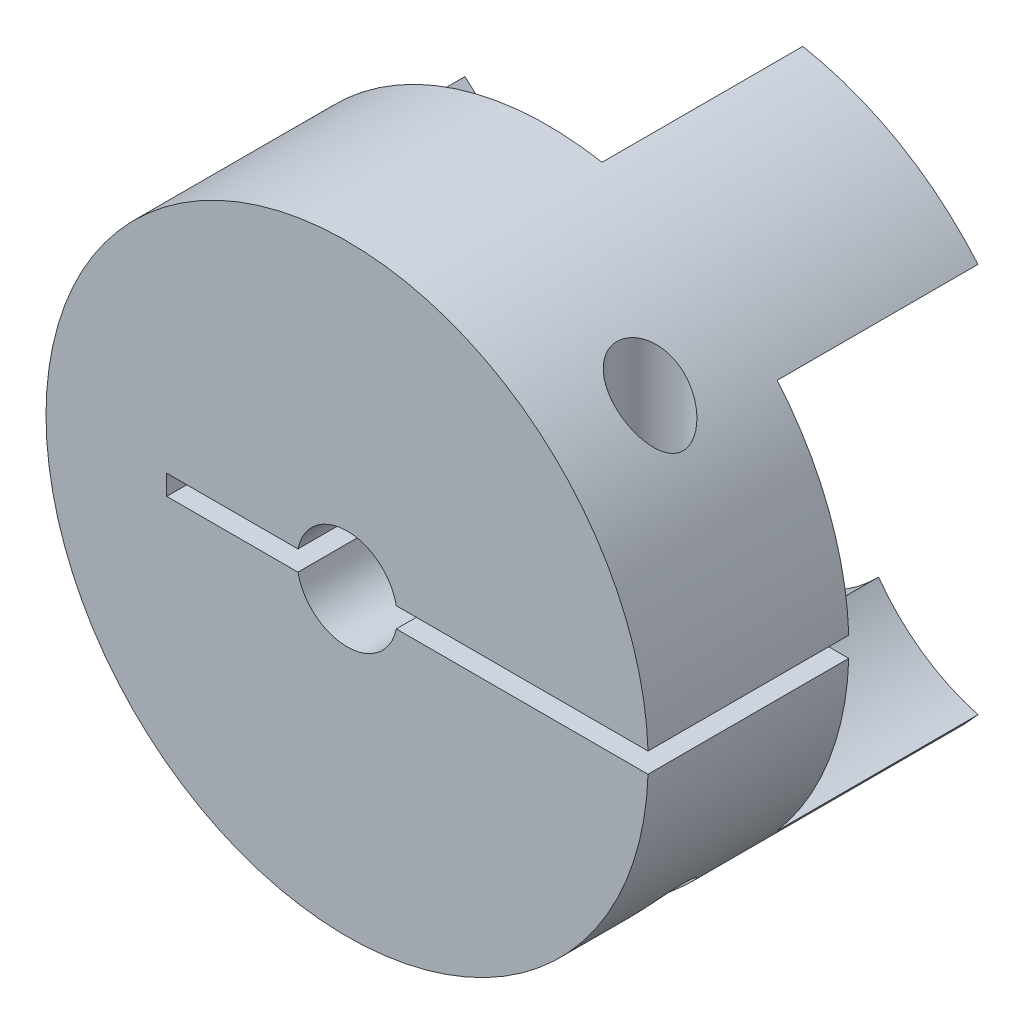
ISO-10303-21;
HEADER;
FILE_DESCRIPTION(('STEP AP214'),'2;1');
FILE_NAME('part.step','',(''),(''),'','','');
FILE_SCHEMA(('AUTOMOTIVE_DESIGN { 1 0 10303 214 1 1 1 1 }'));
ENDSEC;
DATA;
#1=APPLICATION_CONTEXT('core data for automotive mechanical design processes');
#2=APPLICATION_PROTOCOL_DEFINITION('international standard','automotive_design',2000,#1);
#3=PRODUCT_CONTEXT('',#1,'mechanical');
#4=PRODUCT('Part','Part','',(#3));
#5=PRODUCT_RELATED_PRODUCT_CATEGORY('part','',(#4));
#6=PRODUCT_DEFINITION_FORMATION('','',#4);
#7=PRODUCT_DEFINITION_CONTEXT('part definition',#1,'design');
#8=PRODUCT_DEFINITION('design','',#6,#7);
#9=PRODUCT_DEFINITION_SHAPE('','',#8);
#10=(LENGTH_UNIT() NAMED_UNIT(*) SI_UNIT(.MILLI.,.METRE.));
#11=(NAMED_UNIT(*) PLANE_ANGLE_UNIT() SI_UNIT($,.RADIAN.));
#12=(NAMED_UNIT(*) SI_UNIT($,.STERADIAN.) SOLID_ANGLE_UNIT());
#13=UNCERTAINTY_MEASURE_WITH_UNIT(LENGTH_MEASURE(1.E-05),#10,'distance_accuracy_value','');
#14=(GEOMETRIC_REPRESENTATION_CONTEXT(3) GLOBAL_UNCERTAINTY_ASSIGNED_CONTEXT((#13)) GLOBAL_UNIT_ASSIGNED_CONTEXT((#10,
#11,#12)) REPRESENTATION_CONTEXT('',''));
#15=CARTESIAN_POINT('',(0.,0.,0.));
#16=DIRECTION('',(0.,0.,1.));
#17=DIRECTION('',(1.,0.,0.));
#18=AXIS2_PLACEMENT_3D('',#15,#16,#17);
#19=CARTESIAN_POINT('',(0.,0.,10.));
#20=DIRECTION('',(0.,0.,-1.));
#21=DIRECTION('',(-1.,0.,0.));
#22=AXIS2_PLACEMENT_3D('',#19,#20,#21);
#23=CYLINDRICAL_SURFACE('',#22,15.);
#24=CARTESIAN_POINT('',(10.0926848649986,-11.0967433157584,6.64999999999999));
#25=CARTESIAN_POINT('',(10.220860438559,-10.980160062095,6.65000394336876));
#26=CARTESIAN_POINT('',(10.3471273917052,-10.8612229269204,6.63510189683597));
#27=CARTESIAN_POINT('',(10.5924882536645,-10.6220844812711,6.57754707789749));
#28=CARTESIAN_POINT('',(10.7115592667889,-10.5018804321502,6.53481035021963));
#29=CARTESIAN_POINT('',(10.9206842152966,-10.2838537071165,6.4311611472555));
#30=CARTESIAN_POINT('',(11.0123038847876,-10.1855773433474,6.37434827049272));
#31=CARTESIAN_POINT('',(11.1859779645528,-9.99451888211022,6.24064404925776));
#32=CARTESIAN_POINT('',(11.2680579371859,-9.90172244553978,6.16380823944328));
#33=CARTESIAN_POINT('',(11.3910130445927,-9.75961732755676,6.02083932939631));
#34=CARTESIAN_POINT('',(11.4358416775011,-9.70699350710171,5.96139536279118));
#35=CARTESIAN_POINT('',(11.5189294325514,-9.6082461595792,5.8331563997367));
#36=CARTESIAN_POINT('',(11.5571969249551,-9.56211436409998,5.76437352114217));
#37=CARTESIAN_POINT('',(11.61720832524,-9.48905574163493,5.63420275358693));
#38=CARTESIAN_POINT('',(11.6407280983695,-9.46015253291077,5.57475729279848));
#39=CARTESIAN_POINT('',(11.6812928822604,-9.41001803788935,5.45062994315805));
#40=CARTESIAN_POINT('',(11.6983474363425,-9.38877544601811,5.38595594473009));
#41=CARTESIAN_POINT('',(11.7226402284718,-9.35842022047249,5.26279919580116));
#42=CARTESIAN_POINT('',(11.7309771425616,-9.34795385730711,5.20487142165286));
#43=CARTESIAN_POINT('',(11.7414077625295,-9.33484965184739,5.08758583620345));
#44=CARTESIAN_POINT('',(11.7435052880787,-9.33220701997294,5.02822892225121));
#45=CARTESIAN_POINT('',(11.7412827480735,-9.33500302588684,4.90981268940671));
#46=CARTESIAN_POINT('',(11.7369605290622,-9.34044437538845,4.85075347704508));
#47=CARTESIAN_POINT('',(11.7222562805157,-9.35889108698574,4.73460774907923));
#48=CARTESIAN_POINT('',(11.7118697465427,-9.3719020716119,4.67752273328477));
#49=CARTESIAN_POINT('',(11.6823217305914,-9.40872177270143,4.55196679797297));
#50=CARTESIAN_POINT('',(11.6615720010284,-9.43446897755521,4.48444350956776));
#51=CARTESIAN_POINT('',(11.6132332127112,-9.49390766351091,4.35564766940138));
#52=CARTESIAN_POINT('',(11.5856313515365,-9.52761400953341,4.29438712482309));
#53=CARTESIAN_POINT('',(11.5114868632659,-9.61719101796808,4.15236323153544));
#54=CARTESIAN_POINT('',(11.4619983445573,-9.67622661823834,4.07515644235532));
#55=CARTESIAN_POINT('',(11.3548542023531,-9.80174144821854,3.93353788730325));
#56=CARTESIAN_POINT('',(11.2971810684216,-9.86823657146051,3.86915428462569));
#57=CARTESIAN_POINT('',(11.1922228746545,-9.98692207304509,3.76822768684491));
#58=CARTESIAN_POINT('',(11.146397279409,-10.0380648679906,3.7288816430101));
#59=CARTESIAN_POINT('',(11.0519268701954,-10.1419848088434,3.65615860473044));
#60=CARTESIAN_POINT('',(11.003280852126,-10.1947626482428,3.62278418492222));
#61=CARTESIAN_POINT('',(10.8536593264446,-10.3546753572824,3.53129103419908));
#62=CARTESIAN_POINT('',(10.7489920615334,-10.4633988528853,3.48179467086141));
#63=CARTESIAN_POINT('',(10.5297942497234,-10.6840187150194,3.40461454121079));
#64=CARTESIAN_POINT('',(10.4150877419815,-10.795928802806,3.3774804453615));
#65=CARTESIAN_POINT('',(10.1804192298437,-11.0174866267743,3.34810548693576));
#66=CARTESIAN_POINT('',(10.0604614497835,-11.127136080718,3.34584497150278));
#67=CARTESIAN_POINT('',(9.83623308607321,-11.3255272776318,3.36675714026146));
#68=CARTESIAN_POINT('',(9.73224615598701,-11.4149744827321,3.38624315175335));
#69=CARTESIAN_POINT('',(9.52558957542715,-11.5879767006159,3.4467897267209));
#70=CARTESIAN_POINT('',(9.42291855764459,-11.671538318211,3.48782565484048));
#71=CARTESIAN_POINT('',(9.24408155555656,-11.8134312770049,3.58213740665993));
#72=CARTESIAN_POINT('',(9.16688279938632,-11.8733726450193,3.63102343919311));
#73=CARTESIAN_POINT('',(9.01869485735856,-11.9863164848776,3.74393718530378));
#74=CARTESIAN_POINT('',(8.94769837818342,-12.0393271440691,3.80794677750154));
#75=CARTESIAN_POINT('',(8.8265258901828,-12.1283606004155,3.93891204527335));
#76=CARTESIAN_POINT('',(8.7748568921312,-12.1657408978823,4.00355780863429));
#77=CARTESIAN_POINT('',(8.68048826188,-12.2332534574999,4.14253663246763));
#78=CARTESIAN_POINT('',(8.63778600998008,-12.263387836973,4.21686685324224));
#79=CARTESIAN_POINT('',(8.56345920953926,-12.3154071535883,4.37423245519235));
#80=CARTESIAN_POINT('',(8.53190730351717,-12.337238062868,4.45732050224921));
#81=CARTESIAN_POINT('',(8.48237952216627,-12.3713443284604,4.62931580532342));
#82=CARTESIAN_POINT('',(8.4643950160246,-12.3836257597641,4.71821932267932));
#83=CARTESIAN_POINT('',(8.44451569678631,-12.3971882353683,4.88817885849845));
#84=CARTESIAN_POINT('',(8.44100911115321,-12.3995714254709,4.96896232475433));
#85=CARTESIAN_POINT('',(8.44584457546878,-12.3962784814689,5.12999178577486));
#86=CARTESIAN_POINT('',(8.45418267439061,-12.3906050348137,5.21023795079714));
#87=CARTESIAN_POINT('',(8.48156054926597,-12.3718787449858,5.36416607002223));
#88=CARTESIAN_POINT('',(8.50009990389054,-12.3591708145744,5.43798080021377));
#89=CARTESIAN_POINT('',(8.546548916629,-12.3270958939093,5.58105357268003));
#90=CARTESIAN_POINT('',(8.57445970592201,-12.3077280997699,5.65031106366561));
#91=CARTESIAN_POINT('',(8.63998142157508,-12.2618266323618,5.78621154394235));
#92=CARTESIAN_POINT('',(8.67801142192203,-12.2349801746752,5.85254532283313));
#93=CARTESIAN_POINT('',(8.76132380203988,-12.1754599473585,5.97756245987752));
#94=CARTESIAN_POINT('',(8.8066082488509,-12.1427845165521,6.03624362886971));
#95=CARTESIAN_POINT('',(8.90892316153622,-12.067956917377,6.15235960440661));
#96=CARTESIAN_POINT('',(8.96671505758629,-12.025127823739,6.20868408375652));
#97=CARTESIAN_POINT('',(9.08733597037259,-11.9342386437794,6.31073660691987));
#98=CARTESIAN_POINT('',(9.15017019469147,-11.886173130623,6.35645350090917));
#99=CARTESIAN_POINT('',(9.30868362889243,-11.7627607545485,6.45608296499284));
#100=CARTESIAN_POINT('',(9.40620131746137,-11.6850178304833,6.50412649559903));
#101=CARTESIAN_POINT('',(9.60378242449744,-11.5231815429662,6.57945385732573));
#102=CARTESIAN_POINT('',(9.70384670997769,-11.4390859969937,6.60673051775102));
#103=CARTESIAN_POINT('',(9.85209903926863,-11.3110684951432,6.63310718208843));
#104=CARTESIAN_POINT('',(9.90049346184272,-11.2687344646731,6.6394836552663));
#105=CARTESIAN_POINT('',(9.99690837246945,-11.1832899482693,6.64792786365697));
#106=CARTESIAN_POINT('',(10.044929092772,-11.1401800108535,6.64999853077606));
#107=CARTESIAN_POINT('',(10.0926848649986,-11.0967433157584,6.64999999999999));
#108=B_SPLINE_CURVE_WITH_KNOTS('',3,(#24,#25,#26,#27,#28,#29,#30,#31,#32,#33,#34,#35,#36,#37,
#38,#39,#40,#41,#42,#43,#44,#45,#46,#47,#48,#49,#50,#51,#52,#53,#54,#55,#56,#57,#58,#59,#60,#61,
#62,#63,#64,#65,#66,#67,#68,#69,#70,#71,#72,#73,#74,#75,#76,#77,#78,#79,#80,#81,#82,#83,#84,#85,
#86,#87,#88,#89,#90,#91,#92,#93,#94,#95,#96,#97,#98,#99,#100,#101,#102,#103,#104,#105,#106,
#107),.UNSPECIFIED.,.T.,.F.,(4,2,2,2,2,2,2,2,2,2,2,2,2,2,2,2,2,2,2,2,2,2,2,2,2,2,2,2,2,2,2,2,2,
2,2,2,2,2,2,2,2,4),(0.,0.519563013751446,1.04070044218863,1.47686845704516,1.91183937942442,
2.18464870505687,2.45710736661819,2.6668481800779,2.87627817795231,3.05384656799502,
3.23130623062402,3.40882543425908,3.5864766632454,3.81078920641685,4.0355240483546,
4.3609310771128,4.68704509251657,4.92417500520975,5.16140691024388,5.63582699382098,
6.12158721994665,6.60696361463315,7.02105160658517,7.43466725009816,7.76128715105097,
8.08751765610298,8.3588299592513,8.63006288590478,8.90303161306048,9.17582654617326,
9.41726596898013,9.65862487384102,9.88908129959951,10.119565552609,10.3617025461375,
10.6039086559017,10.8769583737547,11.150293811886,11.549083529721,11.9480108852548,
12.1417220922424,12.335301354288),.UNSPECIFIED.);
#109=CARTESIAN_POINT('',(10.0926848649986,-11.0967433157584,6.64999999999999));
#110=VERTEX_POINT('',#109);
#111=EDGE_CURVE('E43',#110,#110,#108,.T.);
#112=ORIENTED_EDGE('',*,*,#111,.T.);
#113=EDGE_LOOP('',(#112));
#114=FACE_BOUND('',#113,.T.);
#115=CARTESIAN_POINT('',(10.0926848649986,11.0967433157584,3.35000000000001));
#116=CARTESIAN_POINT('',(10.220860438559,10.980160062095,3.34999605663124));
#117=CARTESIAN_POINT('',(10.3471273917052,10.8612229269204,3.36489810316403));
#118=CARTESIAN_POINT('',(10.5924882536645,10.6220844812711,3.42245292210251));
#119=CARTESIAN_POINT('',(10.7115592667889,10.5018804321502,3.46518964978037));
#120=CARTESIAN_POINT('',(10.9206842152966,10.2838537071165,3.5688388527445));
#121=CARTESIAN_POINT('',(11.0123038847876,10.1855773433474,3.62565172950728));
#122=CARTESIAN_POINT('',(11.1859779645528,9.99451888211022,3.75935595074224));
#123=CARTESIAN_POINT('',(11.2680579371859,9.90172244553978,3.83619176055672));
#124=CARTESIAN_POINT('',(11.3910130445927,9.75961732755676,3.97916067060369));
#125=CARTESIAN_POINT('',(11.4358416775011,9.70699350710171,4.03860463720882));
#126=CARTESIAN_POINT('',(11.5189294325514,9.6082461595792,4.1668436002633));
#127=CARTESIAN_POINT('',(11.5571969249551,9.56211436409998,4.23562647885784));
#128=CARTESIAN_POINT('',(11.61720832524,9.48905574163493,4.36579724641307));
#129=CARTESIAN_POINT('',(11.6407280983695,9.46015253291077,4.42524270720152));
#130=CARTESIAN_POINT('',(11.6812928822604,9.41001803788935,4.54937005684195));
#131=CARTESIAN_POINT('',(11.6983474363425,9.38877544601811,4.61404405526991));
#132=CARTESIAN_POINT('',(11.7226402284718,9.35842022047249,4.73720080419884));
#133=CARTESIAN_POINT('',(11.7309771425616,9.34795385730711,4.79512857834714));
#134=CARTESIAN_POINT('',(11.7414077625295,9.33484965184739,4.91241416379655));
#135=CARTESIAN_POINT('',(11.7435052880787,9.33220701997294,4.97177107774879));
#136=CARTESIAN_POINT('',(11.7412827480735,9.33500302588684,5.09018731059329));
#137=CARTESIAN_POINT('',(11.7369605290622,9.34044437538845,5.14924652295492));
#138=CARTESIAN_POINT('',(11.7222562805157,9.35889108698574,5.26539225092077));
#139=CARTESIAN_POINT('',(11.7118697465427,9.3719020716119,5.32247726671523));
#140=CARTESIAN_POINT('',(11.6823217305914,9.40872177270143,5.44803320202703));
#141=CARTESIAN_POINT('',(11.6615720010284,9.43446897755521,5.51555649043224));
#142=CARTESIAN_POINT('',(11.6132332127112,9.49390766351091,5.64435233059862));
#143=CARTESIAN_POINT('',(11.5856313515365,9.52761400953341,5.70561287517691));
#144=CARTESIAN_POINT('',(11.5114868632659,9.61719101796808,5.84763676846456));
#145=CARTESIAN_POINT('',(11.4619983445573,9.67622661823834,5.92484355764468));
#146=CARTESIAN_POINT('',(11.3548542023531,9.80174144821854,6.06646211269675));
#147=CARTESIAN_POINT('',(11.2971810684216,9.86823657146052,6.13084571537431));
#148=CARTESIAN_POINT('',(11.1922228746545,9.98692207304509,6.23177231315509));
#149=CARTESIAN_POINT('',(11.146397279409,10.0380648679906,6.2711183569899));
#150=CARTESIAN_POINT('',(11.0519268701954,10.1419848088434,6.34384139526956));
#151=CARTESIAN_POINT('',(11.003280852126,10.1947626482428,6.37721581507778));
#152=CARTESIAN_POINT('',(10.8536593264446,10.3546753572824,6.46870896580092));
#153=CARTESIAN_POINT('',(10.7489920615334,10.4633988528853,6.51820532913859));
#154=CARTESIAN_POINT('',(10.5297942497234,10.6840187150194,6.59538545878921));
#155=CARTESIAN_POINT('',(10.4150877419815,10.795928802806,6.6225195546385));
#156=CARTESIAN_POINT('',(10.1804192298437,11.0174866267743,6.65189451306424));
#157=CARTESIAN_POINT('',(10.0604614497835,11.127136080718,6.65415502849722));
#158=CARTESIAN_POINT('',(9.83623308607321,11.3255272776318,6.63324285973854));
#159=CARTESIAN_POINT('',(9.73224615598702,11.4149744827321,6.61375684824665));
#160=CARTESIAN_POINT('',(9.52558957542716,11.5879767006159,6.5532102732791));
#161=CARTESIAN_POINT('',(9.4229185576446,11.671538318211,6.51217434515953));
#162=CARTESIAN_POINT('',(9.24408155555657,11.8134312770049,6.41786259334007));
#163=CARTESIAN_POINT('',(9.16688279938632,11.8733726450193,6.3689765608069));
#164=CARTESIAN_POINT('',(9.01869485735856,11.9863164848776,6.25606281469622));
#165=CARTESIAN_POINT('',(8.94769837818342,12.0393271440691,6.19205322249846));
#166=CARTESIAN_POINT('',(8.8265258901828,12.1283606004155,6.06108795472665));
#167=CARTESIAN_POINT('',(8.7748568921312,12.1657408978823,5.99644219136571));
#168=CARTESIAN_POINT('',(8.68048826188,12.2332534574999,5.85746336753238));
#169=CARTESIAN_POINT('',(8.63778600998008,12.263387836973,5.78313314675776));
#170=CARTESIAN_POINT('',(8.56345920953927,12.3154071535883,5.62576754480765));
#171=CARTESIAN_POINT('',(8.53190730351717,12.337238062868,5.5426794977508));
#172=CARTESIAN_POINT('',(8.48237952216627,12.3713443284604,5.37068419467659));
#173=CARTESIAN_POINT('',(8.4643950160246,12.3836257597641,5.28178067732069));
#174=CARTESIAN_POINT('',(8.44451569678631,12.3971882353683,5.11182114150155));
#175=CARTESIAN_POINT('',(8.44100911115321,12.3995714254709,5.03103767524568));
#176=CARTESIAN_POINT('',(8.44584457546878,12.3962784814689,4.87000821422515));
#177=CARTESIAN_POINT('',(8.45418267439061,12.3906050348137,4.78976204920287));
#178=CARTESIAN_POINT('',(8.48156054926597,12.3718787449858,4.63583392997778));
#179=CARTESIAN_POINT('',(8.50009990389053,12.3591708145744,4.56201919978623));
#180=CARTESIAN_POINT('',(8.546548916629,12.3270958939093,4.41894642731997));
#181=CARTESIAN_POINT('',(8.574459705922,12.3077280997699,4.34968893633439));
#182=CARTESIAN_POINT('',(8.63998142157507,12.2618266323618,4.21378845605765));
#183=CARTESIAN_POINT('',(8.67801142192202,12.2349801746752,4.14745467716687));
#184=CARTESIAN_POINT('',(8.76132380203987,12.1754599473585,4.02243754012249));
#185=CARTESIAN_POINT('',(8.8066082488509,12.1427845165521,3.96375637113029));
#186=CARTESIAN_POINT('',(8.90892316153622,12.067956917377,3.84764039559339));
#187=CARTESIAN_POINT('',(8.96671505758628,12.025127823739,3.79131591624349));
#188=CARTESIAN_POINT('',(9.08733597037258,11.9342386437794,3.68926339308014));
#189=CARTESIAN_POINT('',(9.15017019469146,11.886173130623,3.64354649909083));
#190=CARTESIAN_POINT('',(9.30868362889242,11.7627607545485,3.54391703500716));
#191=CARTESIAN_POINT('',(9.40620131746137,11.6850178304834,3.49587350440097));
#192=CARTESIAN_POINT('',(9.60378242449744,11.5231815429662,3.42054614267427));
#193=CARTESIAN_POINT('',(9.70384670997769,11.4390859969937,3.39326948224898));
#194=CARTESIAN_POINT('',(9.85209903926863,11.3110684951432,3.36689281791157));
#195=CARTESIAN_POINT('',(9.90049346184271,11.2687344646732,3.3605163447337));
#196=CARTESIAN_POINT('',(9.99690837246945,11.1832899482693,3.35207213634303));
#197=CARTESIAN_POINT('',(10.044929092772,11.1401800108535,3.35000146922394));
#198=CARTESIAN_POINT('',(10.0926848649986,11.0967433157584,3.35000000000001));
#199=B_SPLINE_CURVE_WITH_KNOTS('',3,(#115,#116,#117,#118,#119,#120,#121,#122,#123,#124,#125,
#126,#127,#128,#129,#130,#131,#132,#133,#134,#135,#136,#137,#138,#139,#140,#141,#142,#143,#144,
#145,#146,#147,#148,#149,#150,#151,#152,#153,#154,#155,#156,#157,#158,#159,#160,#161,#162,#163,
#164,#165,#166,#167,#168,#169,#170,#171,#172,#173,#174,#175,#176,#177,#178,#179,#180,#181,#182,
#183,#184,#185,#186,#187,#188,#189,#190,#191,#192,#193,#194,#195,#196,#197,#198),.UNSPECIFIED.,
.T.,.F.,(4,2,2,2,2,2,2,2,2,2,2,2,2,2,2,2,2,2,2,2,2,2,2,2,2,2,2,2,2,2,2,2,2,2,2,2,2,2,2,2,2,4),
(0.,0.519563013751446,1.04070044218863,1.47686845704516,1.91183937942442,2.18464870505687,
2.45710736661819,2.6668481800779,2.87627817795231,3.05384656799502,3.23130623062402,
3.40882543425908,3.5864766632454,3.81078920641685,4.0355240483546,4.3609310771128,
4.68704509251657,4.92417500520975,5.16140691024388,5.63582699382098,6.12158721994664,
6.60696361463315,7.02105160658516,7.43466725009816,7.76128715105097,8.08751765610297,
8.3588299592513,8.63006288590477,8.90303161306047,9.17582654617325,9.41726596898013,
9.65862487384101,9.8890812995995,10.119565552609,10.3617025461375,10.6039086559017,
10.8769583737547,11.150293811886,11.549083529721,11.9480108852548,12.1417220922424,
12.335301354288),.UNSPECIFIED.);
#200=CARTESIAN_POINT('',(10.0926848649986,11.0967433157584,3.35000000000001));
#201=VERTEX_POINT('',#200);
#202=EDGE_CURVE('E304',#201,#201,#199,.T.);
#203=ORIENTED_EDGE('',*,*,#202,.T.);
#204=EDGE_LOOP('',(#203));
#205=FACE_BOUND('',#204,.T.);
#206=DIRECTION('',(0.,0.,-1.));
#207=VECTOR('',#206,1.);
#208=CARTESIAN_POINT('',(14.9916643505649,0.5,10.));
#209=LINE('',#208,#207);
#210=CARTESIAN_POINT('',(14.9916643505649,0.5,10.));
#211=VERTEX_POINT('',#210);
#212=CARTESIAN_POINT('',(14.9916643505649,0.5,0.));
#213=VERTEX_POINT('',#212);
#214=EDGE_CURVE('E181',#211,#213,#209,.T.);
#215=ORIENTED_EDGE('',*,*,#214,.T.);
#216=CARTESIAN_POINT('',(0.,0.,0.));
#217=DIRECTION('',(0.,0.,1.));
#218=DIRECTION('',(1.,0.,0.));
#219=AXIS2_PLACEMENT_3D('',#216,#217,#218);
#220=CIRCLE('',#219,15.);
#221=CARTESIAN_POINT('',(11.4287329273986,9.71514609638965,0.));
#222=VERTEX_POINT('',#221);
#223=EDGE_CURVE('E68',#213,#222,#220,.T.);
#224=ORIENTED_EDGE('',*,*,#223,.T.);
#225=DIRECTION('',(0.,0.,1.));
#226=VECTOR('',#225,1.);
#227=CARTESIAN_POINT('',(11.4287329273986,9.71514609638965,-10.));
#228=LINE('',#227,#226);
#229=CARTESIAN_POINT('',(11.4287329273986,9.71514609638965,-10.));
#230=VERTEX_POINT('',#229);
#231=EDGE_CURVE('E242',#230,#222,#228,.T.);
#232=ORIENTED_EDGE('',*,*,#231,.F.);
#233=CARTESIAN_POINT('',(0.,0.,-10.));
#234=DIRECTION('',(0.,0.,1.));
#235=DIRECTION('',(1.,0.,0.));
#236=AXIS2_PLACEMENT_3D('',#233,#234,#235);
#237=CIRCLE('',#236,15.);
#238=CARTESIAN_POINT('',(2.69919685725149,14.7551460963897,-10.));
#239=VERTEX_POINT('',#238);
#240=EDGE_CURVE('E222',#230,#239,#237,.T.);
#241=ORIENTED_EDGE('',*,*,#240,.T.);
#242=DIRECTION('',(0.,0.,1.));
#243=VECTOR('',#242,1.);
#244=CARTESIAN_POINT('',(2.69919685725149,14.7551460963897,-10.));
#245=LINE('',#244,#243);
#246=CARTESIAN_POINT('',(2.69919685725149,14.7551460963897,0.));
#247=VERTEX_POINT('',#246);
#248=EDGE_CURVE('E240',#239,#247,#245,.T.);
#249=ORIENTED_EDGE('',*,*,#248,.T.);
#250=CARTESIAN_POINT('',(-14.12792978465,5.04,0.));
#251=VERTEX_POINT('',#250);
#252=EDGE_CURVE('E296',#247,#251,#220,.T.);
#253=ORIENTED_EDGE('',*,*,#252,.T.);
#254=DIRECTION('',(0.,0.,1.));
#255=VECTOR('',#254,1.);
#256=CARTESIAN_POINT('',(-14.12792978465,5.04,-10.));
#257=LINE('',#256,#255);
#258=CARTESIAN_POINT('',(-14.12792978465,5.04,-10.));
#259=VERTEX_POINT('',#258);
#260=EDGE_CURVE('E293',#259,#251,#257,.T.);
#261=ORIENTED_EDGE('',*,*,#260,.F.);
#262=CARTESIAN_POINT('',(0.,0.,-10.));
#263=DIRECTION('',(0.,0.,1.));
#264=DIRECTION('',(1.,0.,0.));
#265=AXIS2_PLACEMENT_3D('',#262,#263,#264);
#266=CIRCLE('',#265,15.);
#267=CARTESIAN_POINT('',(-14.12792978465,-5.04,-10.));
#268=VERTEX_POINT('',#267);
#269=EDGE_CURVE('E273',#259,#268,#266,.T.);
#270=ORIENTED_EDGE('',*,*,#269,.T.);
#271=DIRECTION('',(0.,0.,1.));
#272=VECTOR('',#271,1.);
#273=CARTESIAN_POINT('',(-14.12792978465,-5.04,-10.));
#274=LINE('',#273,#272);
#275=CARTESIAN_POINT('',(-14.12792978465,-5.04,0.));
#276=VERTEX_POINT('',#275);
#277=EDGE_CURVE('E284',#268,#276,#274,.T.);
#278=ORIENTED_EDGE('',*,*,#277,.T.);
#279=CARTESIAN_POINT('',(2.69919685725129,-14.7551460963897,0.));
#280=VERTEX_POINT('',#279);
#281=EDGE_CURVE('E52',#276,#280,#220,.T.);
#282=ORIENTED_EDGE('',*,*,#281,.T.);
#283=DIRECTION('',(0.,0.,1.));
#284=VECTOR('',#283,1.);
#285=CARTESIAN_POINT('',(2.69919685725129,-14.7551460963897,-10.));
#286=LINE('',#285,#284);
#287=CARTESIAN_POINT('',(2.69919685725129,-14.7551460963897,-10.));
#288=VERTEX_POINT('',#287);
#289=EDGE_CURVE('E270',#288,#280,#286,.T.);
#290=ORIENTED_EDGE('',*,*,#289,.F.);
#291=CARTESIAN_POINT('',(0.,0.,-10.));
#292=DIRECTION('',(0.,0.,1.));
#293=DIRECTION('',(1.,0.,0.));
#294=AXIS2_PLACEMENT_3D('',#291,#292,#293);
#295=CIRCLE('',#294,15.);
#296=CARTESIAN_POINT('',(11.4287329273985,-9.7151460963898,-10.));
#297=VERTEX_POINT('',#296);
#298=EDGE_CURVE('E252',#288,#297,#295,.T.);
#299=ORIENTED_EDGE('',*,*,#298,.T.);
#300=DIRECTION('',(0.,0.,1.));
#301=VECTOR('',#300,1.);
#302=CARTESIAN_POINT('',(11.4287329273985,-9.7151460963898,-10.));
#303=LINE('',#302,#301);
#304=CARTESIAN_POINT('',(11.4287329273985,-9.7151460963898,0.));
#305=VERTEX_POINT('',#304);
#306=EDGE_CURVE('E268',#297,#305,#303,.T.);
#307=ORIENTED_EDGE('',*,*,#306,.T.);
#308=CARTESIAN_POINT('',(14.9916643505649,-0.5,0.));
#309=VERTEX_POINT('',#308);
#310=EDGE_CURVE('E205',#305,#309,#220,.T.);
#311=ORIENTED_EDGE('',*,*,#310,.T.);
#312=DIRECTION('',(0.,0.,-1.));
#313=VECTOR('',#312,1.);
#314=CARTESIAN_POINT('',(14.9916643505649,-0.5,10.));
#315=LINE('',#314,#313);
#316=CARTESIAN_POINT('',(14.9916643505649,-0.5,10.));
#317=VERTEX_POINT('',#316);
#318=EDGE_CURVE('E189',#317,#309,#315,.T.);
#319=ORIENTED_EDGE('',*,*,#318,.F.);
#320=CARTESIAN_POINT('',(0.,0.,10.));
#321=DIRECTION('',(0.,0.,1.));
#322=DIRECTION('',(1.,0.,0.));
#323=AXIS2_PLACEMENT_3D('',#320,#321,#322);
#324=CIRCLE('',#323,15.);
#325=EDGE_CURVE('E11',#211,#317,#324,.T.);
#326=ORIENTED_EDGE('',*,*,#325,.F.);
#327=EDGE_LOOP('',(#215,#224,#232,#241,#249,#253,#261,#270,#278,#282,#290,#299,#307,#311,#319,#326));
#328=FACE_BOUND('',#327,.T.);
#329=ADVANCED_FACE('F39',(#114,#205,#328),#23,.T.);
#330=CARTESIAN_POINT('',(0.,0.,10.));
#331=DIRECTION('',(0.,0.,1.));
#332=DIRECTION('',(1.,0.,0.));
#333=AXIS2_PLACEMENT_3D('',#330,#331,#332);
#334=PLANE('',#333);
#335=CARTESIAN_POINT('',(0.,0.,10.));
#336=DIRECTION('',(0.,0.,-1.));
#337=DIRECTION('',(-1.,0.,0.));
#338=AXIS2_PLACEMENT_3D('',#335,#336,#337);
#339=CIRCLE('',#338,2.5);
#340=CARTESIAN_POINT('',(-2.44948974278318,0.5,10.));
#341=VERTEX_POINT('',#340);
#342=CARTESIAN_POINT('',(2.44948974278318,0.5,10.));
#343=VERTEX_POINT('',#342);
#344=EDGE_CURVE('E190',#341,#343,#339,.T.);
#345=ORIENTED_EDGE('',*,*,#344,.T.);
#346=DIRECTION('',(-1.,0.,0.));
#347=VECTOR('',#346,1.);
#348=CARTESIAN_POINT('',(0.,0.5,10.));
#349=LINE('',#348,#347);
#350=EDGE_CURVE('E184',#211,#343,#349,.T.);
#351=ORIENTED_EDGE('',*,*,#350,.F.);
#352=ORIENTED_EDGE('',*,*,#325,.T.);
#353=DIRECTION('',(-1.,0.,0.));
#354=VECTOR('',#353,1.);
#355=CARTESIAN_POINT('',(0.,-0.5,10.));
#356=LINE('',#355,#354);
#357=CARTESIAN_POINT('',(2.44948974278318,-0.5,10.));
#358=VERTEX_POINT('',#357);
#359=EDGE_CURVE('E198',#317,#358,#356,.T.);
#360=ORIENTED_EDGE('',*,*,#359,.T.);
#361=CARTESIAN_POINT('',(0.,0.,10.));
#362=DIRECTION('',(0.,0.,-1.));
#363=DIRECTION('',(-1.,0.,0.));
#364=AXIS2_PLACEMENT_3D('',#361,#362,#363);
#365=CIRCLE('',#364,2.5);
#366=CARTESIAN_POINT('',(-2.44948974278318,-0.5,10.));
#367=VERTEX_POINT('',#366);
#368=EDGE_CURVE('E411',#358,#367,#365,.T.);
#369=ORIENTED_EDGE('',*,*,#368,.T.);
#370=CARTESIAN_POINT('',(-8.98610037780571,-0.5,10.));
#371=VERTEX_POINT('',#370);
#372=EDGE_CURVE('E412',#367,#371,#356,.T.);
#373=ORIENTED_EDGE('',*,*,#372,.T.);
#374=CARTESIAN_POINT('',(0.,0.,10.));
#375=DIRECTION('',(0.,0.,-1.));
#376=DIRECTION('',(-1.,0.,0.));
#377=AXIS2_PLACEMENT_3D('',#374,#375,#376);
#378=CIRCLE('',#377,9.);
#379=CARTESIAN_POINT('',(-8.98610037780571,0.5,10.));
#380=VERTEX_POINT('',#379);
#381=EDGE_CURVE('E415',#371,#380,#378,.T.);
#382=ORIENTED_EDGE('',*,*,#381,.T.);
#383=EDGE_CURVE('E201',#341,#380,#349,.T.);
#384=ORIENTED_EDGE('',*,*,#383,.F.);
#385=EDGE_LOOP('',(#345,#351,#352,#360,#369,#373,#382,#384));
#386=FACE_BOUND('',#385,.T.);
#387=ADVANCED_FACE('F194',(#386),#334,.T.);
#388=CARTESIAN_POINT('',(0.,0.,0.));
#389=DIRECTION('',(0.,0.,1.));
#390=DIRECTION('',(1.,0.,0.));
#391=AXIS2_PLACEMENT_3D('',#388,#389,#390);
#392=PLANE('',#391);
#393=DIRECTION('',(-1.,0.,0.));
#394=VECTOR('',#393,1.);
#395=CARTESIAN_POINT('',(0.,0.5,0.));
#396=LINE('',#395,#394);
#397=CARTESIAN_POINT('',(2.44948974278318,0.5,0.));
#398=VERTEX_POINT('',#397);
#399=EDGE_CURVE('E187',#213,#398,#396,.T.);
#400=ORIENTED_EDGE('',*,*,#399,.T.);
#401=CARTESIAN_POINT('',(0.,0.,0.));
#402=DIRECTION('',(0.,0.,-1.));
#403=DIRECTION('',(-1.,0.,0.));
#404=AXIS2_PLACEMENT_3D('',#401,#402,#403);
#405=CIRCLE('',#404,2.5);
#406=CARTESIAN_POINT('',(-2.44948974278318,0.5,0.));
#407=VERTEX_POINT('',#406);
#408=EDGE_CURVE('E199',#407,#398,#405,.T.);
#409=ORIENTED_EDGE('',*,*,#408,.F.);
#410=CARTESIAN_POINT('',(-8.98610037780571,0.5,0.));
#411=VERTEX_POINT('',#410);
#412=EDGE_CURVE('E421',#407,#411,#396,.T.);
#413=ORIENTED_EDGE('',*,*,#412,.T.);
#414=CARTESIAN_POINT('',(0.,0.,0.));
#415=DIRECTION('',(0.,0.,1.));
#416=DIRECTION('',(1.,0.,0.));
#417=AXIS2_PLACEMENT_3D('',#414,#415,#416);
#418=CIRCLE('',#417,9.);
#419=CARTESIAN_POINT('',(-8.65013150189059,2.48499999999999,0.));
#420=VERTEX_POINT('',#419);
#421=EDGE_CURVE('E288',#420,#411,#418,.T.);
#422=ORIENTED_EDGE('',*,*,#421,.F.);
#423=CARTESIAN_POINT('',(-7.80556259587179,11.4452847813552,0.));
#424=DIRECTION('',(0.,0.,1.));
#425=DIRECTION('',(1.,0.,0.));
#426=AXIS2_PLACEMENT_3D('',#423,#424,#425);
#427=CIRCLE('',#426,9.);
#428=EDGE_CURVE('E277',#420,#251,#427,.F.);
#429=ORIENTED_EDGE('',*,*,#428,.T.);
#430=ORIENTED_EDGE('',*,*,#252,.F.);
#431=CARTESIAN_POINT('',(-6.00912607626511,12.4824578895322,0.));
#432=DIRECTION('',(0.,0.,1.));
#433=DIRECTION('',(1.,0.,0.));
#434=AXIS2_PLACEMENT_3D('',#431,#432,#433);
#435=CIRCLE('',#434,9.00000000000001);
#436=CARTESIAN_POINT('',(2.17299262254101,8.73373362671329,0.));
#437=VERTEX_POINT('',#436);
#438=EDGE_CURVE('E219',#437,#247,#435,.T.);
#439=ORIENTED_EDGE('',*,*,#438,.F.);
#440=CARTESIAN_POINT('',(0.,0.,0.));
#441=DIRECTION('',(0.,0.,1.));
#442=DIRECTION('',(1.,0.,0.));
#443=AXIS2_PLACEMENT_3D('',#440,#441,#442);
#444=CIRCLE('',#443,9.);
#445=CARTESIAN_POINT('',(6.47713887934965,6.24873362671327,0.));
#446=VERTEX_POINT('',#445);
#447=EDGE_CURVE('E228',#446,#437,#444,.T.);
#448=ORIENTED_EDGE('',*,*,#447,.F.);
#449=CARTESIAN_POINT('',(13.814688672137,1.0371731081769,0.));
#450=DIRECTION('',(0.,0.,1.));
#451=DIRECTION('',(1.,0.,0.));
#452=AXIS2_PLACEMENT_3D('',#449,#450,#451);
#453=CIRCLE('',#452,9.);
#454=EDGE_CURVE('E231',#446,#222,#453,.F.);
#455=ORIENTED_EDGE('',*,*,#454,.T.);
#456=ORIENTED_EDGE('',*,*,#223,.F.);
#457=EDGE_LOOP('',(#400,#409,#413,#422,#429,#430,#439,#448,#455,#456));
#458=FACE_BOUND('',#457,.T.);
#459=ADVANCED_FACE('F384',(#458),#392,.F.);
#460=CARTESIAN_POINT('',(-8.98610037780571,-0.5,0.));
#461=VERTEX_POINT('',#460);
#462=CARTESIAN_POINT('',(-8.65013150189059,-2.485,0.));
#463=VERTEX_POINT('',#462);
#464=EDGE_CURVE('E287',#461,#463,#418,.T.);
#465=ORIENTED_EDGE('',*,*,#464,.F.);
#466=DIRECTION('',(-1.,0.,0.));
#467=VECTOR('',#466,1.);
#468=CARTESIAN_POINT('',(0.,-0.5,0.));
#469=LINE('',#468,#467);
#470=CARTESIAN_POINT('',(-2.44948974278318,-0.5,0.));
#471=VERTEX_POINT('',#470);
#472=EDGE_CURVE('E60',#471,#461,#469,.T.);
#473=ORIENTED_EDGE('',*,*,#472,.F.);
#474=CARTESIAN_POINT('',(0.,0.,0.));
#475=DIRECTION('',(0.,0.,-1.));
#476=DIRECTION('',(-1.,0.,0.));
#477=AXIS2_PLACEMENT_3D('',#474,#475,#476);
#478=CIRCLE('',#477,2.5);
#479=CARTESIAN_POINT('',(2.44948974278318,-0.5,0.));
#480=VERTEX_POINT('',#479);
#481=EDGE_CURVE('E423',#480,#471,#478,.T.);
#482=ORIENTED_EDGE('',*,*,#481,.F.);
#483=EDGE_CURVE('E420',#309,#480,#469,.T.);
#484=ORIENTED_EDGE('',*,*,#483,.F.);
#485=ORIENTED_EDGE('',*,*,#310,.F.);
#486=CARTESIAN_POINT('',(13.8146886721369,-1.03717310817709,0.));
#487=DIRECTION('',(0.,0.,1.));
#488=DIRECTION('',(1.,0.,0.));
#489=AXIS2_PLACEMENT_3D('',#486,#487,#488);
#490=CIRCLE('',#489,9.);
#491=CARTESIAN_POINT('',(6.47713887934957,-6.24873362671335,0.));
#492=VERTEX_POINT('',#491);
#493=EDGE_CURVE('E249',#492,#305,#490,.T.);
#494=ORIENTED_EDGE('',*,*,#493,.F.);
#495=CARTESIAN_POINT('',(0.,0.,0.));
#496=DIRECTION('',(0.,0.,1.));
#497=DIRECTION('',(1.,0.,0.));
#498=AXIS2_PLACEMENT_3D('',#495,#496,#497);
#499=CIRCLE('',#498,9.);
#500=CARTESIAN_POINT('',(2.17299262254089,-8.73373362671331,0.));
#501=VERTEX_POINT('',#500);
#502=EDGE_CURVE('E239',#501,#492,#499,.T.);
#503=ORIENTED_EDGE('',*,*,#502,.F.);
#504=CARTESIAN_POINT('',(-6.00912607626528,-12.4824578895321,0.));
#505=DIRECTION('',(0.,0.,1.));
#506=DIRECTION('',(1.,0.,0.));
#507=AXIS2_PLACEMENT_3D('',#504,#505,#506);
#508=CIRCLE('',#507,9.);
#509=EDGE_CURVE('E260',#501,#280,#508,.F.);
#510=ORIENTED_EDGE('',*,*,#509,.T.);
#511=ORIENTED_EDGE('',*,*,#281,.F.);
#512=CARTESIAN_POINT('',(-7.80556259587179,-11.4452847813552,0.));
#513=DIRECTION('',(0.,0.,1.));
#514=DIRECTION('',(1.,0.,0.));
#515=AXIS2_PLACEMENT_3D('',#512,#513,#514);
#516=CIRCLE('',#515,9.);
#517=EDGE_CURVE('E267',#463,#276,#516,.T.);
#518=ORIENTED_EDGE('',*,*,#517,.F.);
#519=EDGE_LOOP('',(#465,#473,#482,#484,#485,#494,#503,#510,#511,#518));
#520=FACE_BOUND('',#519,.T.);
#521=ADVANCED_FACE('F375',(#520),#392,.F.);
#522=CARTESIAN_POINT('',(-7.80556259587179,11.4452847813552,-10.));
#523=DIRECTION('',(0.,0.,1.));
#524=DIRECTION('',(1.,0.,0.));
#525=AXIS2_PLACEMENT_3D('',#522,#523,#524);
#526=CYLINDRICAL_SURFACE('',#525,9.);
#527=ORIENTED_EDGE('',*,*,#428,.F.);
#528=DIRECTION('',(0.,0.,1.));
#529=VECTOR('',#528,1.);
#530=CARTESIAN_POINT('',(-8.65013150189059,2.48499999999999,-10.));
#531=LINE('',#530,#529);
#532=CARTESIAN_POINT('',(-8.65013150189059,2.48499999999999,-10.));
#533=VERTEX_POINT('',#532);
#534=EDGE_CURVE('E297',#533,#420,#531,.T.);
#535=ORIENTED_EDGE('',*,*,#534,.F.);
#536=CARTESIAN_POINT('',(-7.80556259587179,11.4452847813552,-10.));
#537=DIRECTION('',(0.,0.,1.));
#538=DIRECTION('',(1.,0.,0.));
#539=AXIS2_PLACEMENT_3D('',#536,#537,#538);
#540=CIRCLE('',#539,9.);
#541=EDGE_CURVE('E281',#533,#259,#540,.F.);
#542=ORIENTED_EDGE('',*,*,#541,.T.);
#543=ORIENTED_EDGE('',*,*,#260,.T.);
#544=EDGE_LOOP('',(#527,#535,#542,#543));
#545=FACE_BOUND('',#544,.T.);
#546=ADVANCED_FACE('F371',(#545),#526,.F.);
#547=CARTESIAN_POINT('',(0.,0.,-10.));
#548=DIRECTION('',(0.,0.,1.));
#549=DIRECTION('',(1.,0.,0.));
#550=AXIS2_PLACEMENT_3D('',#547,#548,#549);
#551=CYLINDRICAL_SURFACE('',#550,9.);
#552=ORIENTED_EDGE('',*,*,#421,.T.);
#553=DIRECTION('',(0.,0.,-1.));
#554=VECTOR('',#553,1.);
#555=CARTESIAN_POINT('',(-8.98610037780571,0.5,10.));
#556=LINE('',#555,#554);
#557=EDGE_CURVE('E431',#380,#411,#556,.T.);
#558=ORIENTED_EDGE('',*,*,#557,.F.);
#559=ORIENTED_EDGE('',*,*,#381,.F.);
#560=DIRECTION('',(0.,0.,-1.));
#561=VECTOR('',#560,1.);
#562=CARTESIAN_POINT('',(-8.98610037780571,-0.5,10.));
#563=LINE('',#562,#561);
#564=EDGE_CURVE('E433',#371,#461,#563,.T.);
#565=ORIENTED_EDGE('',*,*,#564,.T.);
#566=ORIENTED_EDGE('',*,*,#464,.T.);
#567=DIRECTION('',(0.,0.,1.));
#568=VECTOR('',#567,1.);
#569=CARTESIAN_POINT('',(-8.65013150189059,-2.485,-10.));
#570=LINE('',#569,#568);
#571=CARTESIAN_POINT('',(-8.65013150189059,-2.485,-10.));
#572=VERTEX_POINT('',#571);
#573=EDGE_CURVE('E299',#572,#463,#570,.T.);
#574=ORIENTED_EDGE('',*,*,#573,.F.);
#575=CARTESIAN_POINT('',(0.,0.,-10.));
#576=DIRECTION('',(0.,0.,1.));
#577=DIRECTION('',(1.,0.,0.));
#578=AXIS2_PLACEMENT_3D('',#575,#576,#577);
#579=CIRCLE('',#578,9.);
#580=EDGE_CURVE('E279',#533,#572,#579,.T.);
#581=ORIENTED_EDGE('',*,*,#580,.F.);
#582=ORIENTED_EDGE('',*,*,#534,.T.);
#583=EDGE_LOOP('',(#552,#558,#559,#565,#566,#574,#581,#582));
#584=FACE_BOUND('',#583,.T.);
#585=ADVANCED_FACE('F374',(#584),#551,.F.);
#586=CARTESIAN_POINT('',(-7.80556259587179,-11.4452847813552,-10.));
#587=DIRECTION('',(0.,0.,1.));
#588=DIRECTION('',(1.,0.,0.));
#589=AXIS2_PLACEMENT_3D('',#586,#587,#588);
#590=CYLINDRICAL_SURFACE('',#589,9.);
#591=ORIENTED_EDGE('',*,*,#517,.T.);
#592=ORIENTED_EDGE('',*,*,#277,.F.);
#593=CARTESIAN_POINT('',(-7.80556259587179,-11.4452847813552,-10.));
#594=DIRECTION('',(0.,0.,1.));
#595=DIRECTION('',(1.,0.,0.));
#596=AXIS2_PLACEMENT_3D('',#593,#594,#595);
#597=CIRCLE('',#596,9.);
#598=EDGE_CURVE('E276',#572,#268,#597,.T.);
#599=ORIENTED_EDGE('',*,*,#598,.F.);
#600=ORIENTED_EDGE('',*,*,#573,.T.);
#601=EDGE_LOOP('',(#591,#592,#599,#600));
#602=FACE_BOUND('',#601,.T.);
#603=ADVANCED_FACE('F369',(#602),#590,.F.);
#604=CARTESIAN_POINT('',(0.,0.,-10.));
#605=DIRECTION('',(0.,0.,1.));
#606=DIRECTION('',(1.,0.,0.));
#607=AXIS2_PLACEMENT_3D('',#604,#605,#606);
#608=PLANE('',#607);
#609=ORIENTED_EDGE('',*,*,#269,.F.);
#610=ORIENTED_EDGE('',*,*,#541,.F.);
#611=ORIENTED_EDGE('',*,*,#580,.T.);
#612=ORIENTED_EDGE('',*,*,#598,.T.);
#613=EDGE_LOOP('',(#609,#610,#611,#612));
#614=FACE_BOUND('',#613,.T.);
#615=ADVANCED_FACE('F365',(#614),#608,.F.);
#616=CARTESIAN_POINT('',(0.,0.,-10.));
#617=DIRECTION('',(0.,0.,1.));
#618=DIRECTION('',(1.,0.,0.));
#619=AXIS2_PLACEMENT_3D('',#616,#617,#618);
#620=CYLINDRICAL_SURFACE('',#619,9.);
#621=ORIENTED_EDGE('',*,*,#502,.T.);
#622=DIRECTION('',(0.,0.,1.));
#623=VECTOR('',#622,1.);
#624=CARTESIAN_POINT('',(6.47713887934957,-6.24873362671335,-10.));
#625=LINE('',#624,#623);
#626=CARTESIAN_POINT('',(6.47713887934957,-6.24873362671335,-10.));
#627=VERTEX_POINT('',#626);
#628=EDGE_CURVE('E265',#627,#492,#625,.T.);
#629=ORIENTED_EDGE('',*,*,#628,.F.);
#630=CARTESIAN_POINT('',(0.,0.,-10.));
#631=DIRECTION('',(0.,0.,1.));
#632=DIRECTION('',(1.,0.,0.));
#633=AXIS2_PLACEMENT_3D('',#630,#631,#632);
#634=CIRCLE('',#633,9.);
#635=CARTESIAN_POINT('',(2.17299262254089,-8.73373362671331,-10.));
#636=VERTEX_POINT('',#635);
#637=EDGE_CURVE('E245',#636,#627,#634,.T.);
#638=ORIENTED_EDGE('',*,*,#637,.F.);
#639=DIRECTION('',(0.,0.,1.));
#640=VECTOR('',#639,1.);
#641=CARTESIAN_POINT('',(2.17299262254089,-8.73373362671331,-10.));
#642=LINE('',#641,#640);
#643=EDGE_CURVE('E257',#636,#501,#642,.T.);
#644=ORIENTED_EDGE('',*,*,#643,.T.);
#645=EDGE_LOOP('',(#621,#629,#638,#644));
#646=FACE_BOUND('',#645,.T.);
#647=ADVANCED_FACE('F358',(#646),#620,.F.);
#648=CARTESIAN_POINT('',(13.8146886721369,-1.03717310817709,-10.));
#649=DIRECTION('',(0.,0.,1.));
#650=DIRECTION('',(1.,0.,0.));
#651=AXIS2_PLACEMENT_3D('',#648,#649,#650);
#652=CYLINDRICAL_SURFACE('',#651,9.);
#653=ORIENTED_EDGE('',*,*,#493,.T.);
#654=ORIENTED_EDGE('',*,*,#306,.F.);
#655=CARTESIAN_POINT('',(13.8146886721369,-1.03717310817709,-10.));
#656=DIRECTION('',(0.,0.,1.));
#657=DIRECTION('',(1.,0.,0.));
#658=AXIS2_PLACEMENT_3D('',#655,#656,#657);
#659=CIRCLE('',#658,9.);
#660=EDGE_CURVE('E255',#627,#297,#659,.T.);
#661=ORIENTED_EDGE('',*,*,#660,.F.);
#662=ORIENTED_EDGE('',*,*,#628,.T.);
#663=EDGE_LOOP('',(#653,#654,#661,#662));
#664=FACE_BOUND('',#663,.T.);
#665=ADVANCED_FACE('F355',(#664),#652,.F.);
#666=CARTESIAN_POINT('',(-6.00912607626528,-12.4824578895321,-10.));
#667=DIRECTION('',(0.,0.,1.));
#668=DIRECTION('',(1.,0.,0.));
#669=AXIS2_PLACEMENT_3D('',#666,#667,#668);
#670=CYLINDRICAL_SURFACE('',#669,9.);
#671=ORIENTED_EDGE('',*,*,#509,.F.);
#672=ORIENTED_EDGE('',*,*,#643,.F.);
#673=CARTESIAN_POINT('',(-6.00912607626528,-12.4824578895321,-10.));
#674=DIRECTION('',(0.,0.,1.));
#675=DIRECTION('',(1.,0.,0.));
#676=AXIS2_PLACEMENT_3D('',#673,#674,#675);
#677=CIRCLE('',#676,9.);
#678=EDGE_CURVE('E248',#636,#288,#677,.F.);
#679=ORIENTED_EDGE('',*,*,#678,.T.);
#680=ORIENTED_EDGE('',*,*,#289,.T.);
#681=EDGE_LOOP('',(#671,#672,#679,#680));
#682=FACE_BOUND('',#681,.T.);
#683=ADVANCED_FACE('F353',(#682),#670,.F.);
#684=CARTESIAN_POINT('',(0.,0.,-10.));
#685=DIRECTION('',(0.,0.,1.));
#686=DIRECTION('',(1.,0.,0.));
#687=AXIS2_PLACEMENT_3D('',#684,#685,#686);
#688=PLANE('',#687);
#689=ORIENTED_EDGE('',*,*,#637,.T.);
#690=ORIENTED_EDGE('',*,*,#660,.T.);
#691=ORIENTED_EDGE('',*,*,#298,.F.);
#692=ORIENTED_EDGE('',*,*,#678,.F.);
#693=EDGE_LOOP('',(#689,#690,#691,#692));
#694=FACE_BOUND('',#693,.T.);
#695=ADVANCED_FACE('F349',(#694),#688,.F.);
#696=CARTESIAN_POINT('',(0.,0.,-10.));
#697=DIRECTION('',(0.,0.,1.));
#698=DIRECTION('',(1.,0.,0.));
#699=AXIS2_PLACEMENT_3D('',#696,#697,#698);
#700=CYLINDRICAL_SURFACE('',#699,9.);
#701=ORIENTED_EDGE('',*,*,#447,.T.);
#702=DIRECTION('',(0.,0.,1.));
#703=VECTOR('',#702,1.);
#704=CARTESIAN_POINT('',(2.17299262254101,8.73373362671329,-10.));
#705=LINE('',#704,#703);
#706=CARTESIAN_POINT('',(2.17299262254101,8.73373362671329,-10.));
#707=VERTEX_POINT('',#706);
#708=EDGE_CURVE('E237',#707,#437,#705,.T.);
#709=ORIENTED_EDGE('',*,*,#708,.F.);
#710=CARTESIAN_POINT('',(0.,0.,-10.));
#711=DIRECTION('',(0.,0.,1.));
#712=DIRECTION('',(1.,0.,0.));
#713=AXIS2_PLACEMENT_3D('',#710,#711,#712);
#714=CIRCLE('',#713,9.);
#715=CARTESIAN_POINT('',(6.47713887934965,6.24873362671327,-10.));
#716=VERTEX_POINT('',#715);
#717=EDGE_CURVE('E215',#716,#707,#714,.T.);
#718=ORIENTED_EDGE('',*,*,#717,.F.);
#719=DIRECTION('',(0.,0.,1.));
#720=VECTOR('',#719,1.);
#721=CARTESIAN_POINT('',(6.47713887934965,6.24873362671327,-10.));
#722=LINE('',#721,#720);
#723=EDGE_CURVE('E227',#716,#446,#722,.T.);
#724=ORIENTED_EDGE('',*,*,#723,.T.);
#725=EDGE_LOOP('',(#701,#709,#718,#724));
#726=FACE_BOUND('',#725,.T.);
#727=ADVANCED_FACE('F342',(#726),#700,.F.);
#728=CARTESIAN_POINT('',(-6.00912607626511,12.4824578895322,-10.));
#729=DIRECTION('',(0.,0.,1.));
#730=DIRECTION('',(1.,0.,0.));
#731=AXIS2_PLACEMENT_3D('',#728,#729,#730);
#732=CYLINDRICAL_SURFACE('',#731,9.00000000000001);
#733=ORIENTED_EDGE('',*,*,#438,.T.);
#734=ORIENTED_EDGE('',*,*,#248,.F.);
#735=CARTESIAN_POINT('',(-6.00912607626511,12.4824578895322,-10.));
#736=DIRECTION('',(0.,0.,1.));
#737=DIRECTION('',(1.,0.,0.));
#738=AXIS2_PLACEMENT_3D('',#735,#736,#737);
#739=CIRCLE('',#738,9.00000000000001);
#740=EDGE_CURVE('E225',#707,#239,#739,.T.);
#741=ORIENTED_EDGE('',*,*,#740,.F.);
#742=ORIENTED_EDGE('',*,*,#708,.T.);
#743=EDGE_LOOP('',(#733,#734,#741,#742));
#744=FACE_BOUND('',#743,.T.);
#745=ADVANCED_FACE('F339',(#744),#732,.F.);
#746=CARTESIAN_POINT('',(13.814688672137,1.0371731081769,-10.));
#747=DIRECTION('',(0.,0.,1.));
#748=DIRECTION('',(1.,0.,0.));
#749=AXIS2_PLACEMENT_3D('',#746,#747,#748);
#750=CYLINDRICAL_SURFACE('',#749,9.);
#751=ORIENTED_EDGE('',*,*,#454,.F.);
#752=ORIENTED_EDGE('',*,*,#723,.F.);
#753=CARTESIAN_POINT('',(13.814688672137,1.0371731081769,-10.));
#754=DIRECTION('',(0.,0.,1.));
#755=DIRECTION('',(1.,0.,0.));
#756=AXIS2_PLACEMENT_3D('',#753,#754,#755);
#757=CIRCLE('',#756,9.);
#758=EDGE_CURVE('E218',#716,#230,#757,.F.);
#759=ORIENTED_EDGE('',*,*,#758,.T.);
#760=ORIENTED_EDGE('',*,*,#231,.T.);
#761=EDGE_LOOP('',(#751,#752,#759,#760));
#762=FACE_BOUND('',#761,.T.);
#763=ADVANCED_FACE('F337',(#762),#750,.F.);
#764=CARTESIAN_POINT('',(0.,0.,-10.));
#765=DIRECTION('',(0.,0.,1.));
#766=DIRECTION('',(1.,0.,0.));
#767=AXIS2_PLACEMENT_3D('',#764,#765,#766);
#768=PLANE('',#767);
#769=ORIENTED_EDGE('',*,*,#717,.T.);
#770=ORIENTED_EDGE('',*,*,#740,.T.);
#771=ORIENTED_EDGE('',*,*,#240,.F.);
#772=ORIENTED_EDGE('',*,*,#758,.F.);
#773=EDGE_LOOP('',(#769,#770,#771,#772));
#774=FACE_BOUND('',#773,.T.);
#775=ADVANCED_FACE('F334',(#774),#768,.F.);
#776=CARTESIAN_POINT('',(0.,0.5,10.));
#777=DIRECTION('',(0.,-1.,0.));
#778=DIRECTION('',(0.,0.,-1.));
#779=AXIS2_PLACEMENT_3D('',#776,#777,#778);
#780=PLANE('',#779);
#781=CARTESIAN_POINT('',(10.0926848649986,0.499999999999999,5.));
#782=DIRECTION('',(0.,-1.,0.));
#783=DIRECTION('',(0.,0.,-1.));
#784=AXIS2_PLACEMENT_3D('',#781,#782,#783);
#785=CIRCLE('',#784,1.64999999999999);
#786=CARTESIAN_POINT('',(10.0926848649986,0.499999999999999,3.35000000000001));
#787=VERTEX_POINT('',#786);
#788=EDGE_CURVE('E310',#787,#787,#785,.T.);
#789=ORIENTED_EDGE('',*,*,#788,.F.);
#790=EDGE_LOOP('',(#789));
#791=FACE_BOUND('',#790,.T.);
#792=ORIENTED_EDGE('',*,*,#399,.F.);
#793=ORIENTED_EDGE('',*,*,#214,.F.);
#794=ORIENTED_EDGE('',*,*,#350,.T.);
#795=DIRECTION('',(0.,0.,-1.));
#796=VECTOR('',#795,1.);
#797=CARTESIAN_POINT('',(2.44948974278318,0.5,10.));
#798=LINE('',#797,#796);
#799=EDGE_CURVE('E232',#343,#398,#798,.T.);
#800=ORIENTED_EDGE('',*,*,#799,.T.);
#801=EDGE_LOOP('',(#792,#793,#794,#800));
#802=FACE_BOUND('',#801,.T.);
#803=ADVANCED_FACE('F183',(#791,#802),#780,.T.);
#804=CARTESIAN_POINT('',(0.,0.,10.));
#805=DIRECTION('',(0.,0.,-1.));
#806=DIRECTION('',(-1.,0.,0.));
#807=AXIS2_PLACEMENT_3D('',#804,#805,#806);
#808=CYLINDRICAL_SURFACE('',#807,2.5);
#809=ORIENTED_EDGE('',*,*,#408,.T.);
#810=ORIENTED_EDGE('',*,*,#799,.F.);
#811=ORIENTED_EDGE('',*,*,#344,.F.);
#812=DIRECTION('',(0.,0.,-1.));
#813=VECTOR('',#812,1.);
#814=CARTESIAN_POINT('',(-2.44948974278318,0.5,10.));
#815=LINE('',#814,#813);
#816=EDGE_CURVE('E429',#341,#407,#815,.T.);
#817=ORIENTED_EDGE('',*,*,#816,.T.);
#818=EDGE_LOOP('',(#809,#810,#811,#817));
#819=FACE_BOUND('',#818,.T.);
#820=ADVANCED_FACE('F319',(#819),#808,.F.);
#821=ORIENTED_EDGE('',*,*,#412,.F.);
#822=ORIENTED_EDGE('',*,*,#816,.F.);
#823=ORIENTED_EDGE('',*,*,#383,.T.);
#824=ORIENTED_EDGE('',*,*,#557,.T.);
#825=EDGE_LOOP('',(#821,#822,#823,#824));
#826=FACE_BOUND('',#825,.T.);
#827=ADVANCED_FACE('F322',(#826),#780,.T.);
#828=CARTESIAN_POINT('',(0.,-0.5,10.));
#829=DIRECTION('',(0.,-1.,0.));
#830=DIRECTION('',(0.,0.,-1.));
#831=AXIS2_PLACEMENT_3D('',#828,#829,#830);
#832=PLANE('',#831);
#833=ORIENTED_EDGE('',*,*,#472,.T.);
#834=ORIENTED_EDGE('',*,*,#564,.F.);
#835=ORIENTED_EDGE('',*,*,#372,.F.);
#836=DIRECTION('',(0.,0.,-1.));
#837=VECTOR('',#836,1.);
#838=CARTESIAN_POINT('',(-2.44948974278318,-0.5,10.));
#839=LINE('',#838,#837);
#840=EDGE_CURVE('E211',#367,#471,#839,.T.);
#841=ORIENTED_EDGE('',*,*,#840,.T.);
#842=EDGE_LOOP('',(#833,#834,#835,#841));
#843=FACE_BOUND('',#842,.T.);
#844=ADVANCED_FACE('F326',(#843),#832,.F.);
#845=CARTESIAN_POINT('',(0.,0.,10.));
#846=DIRECTION('',(0.,0.,-1.));
#847=DIRECTION('',(-1.,0.,0.));
#848=AXIS2_PLACEMENT_3D('',#845,#846,#847);
#849=CYLINDRICAL_SURFACE('',#848,2.5);
#850=ORIENTED_EDGE('',*,*,#481,.T.);
#851=ORIENTED_EDGE('',*,*,#840,.F.);
#852=ORIENTED_EDGE('',*,*,#368,.F.);
#853=DIRECTION('',(0.,0.,-1.));
#854=VECTOR('',#853,1.);
#855=CARTESIAN_POINT('',(2.44948974278318,-0.5,10.));
#856=LINE('',#855,#854);
#857=EDGE_CURVE('E209',#358,#480,#856,.T.);
#858=ORIENTED_EDGE('',*,*,#857,.T.);
#859=EDGE_LOOP('',(#850,#851,#852,#858));
#860=FACE_BOUND('',#859,.T.);
#861=ADVANCED_FACE('F330',(#860),#849,.F.);
#862=CARTESIAN_POINT('',(10.0926848649986,-0.499999999999999,5.));
#863=DIRECTION('',(0.,1.,0.));
#864=DIRECTION('',(0.,0.,1.));
#865=AXIS2_PLACEMENT_3D('',#862,#863,#864);
#866=CIRCLE('',#865,1.64999999999999);
#867=CARTESIAN_POINT('',(10.0926848649986,-0.499999999999999,6.64999999999999));
#868=VERTEX_POINT('',#867);
#869=EDGE_CURVE('E402',#868,#868,#866,.T.);
#870=ORIENTED_EDGE('',*,*,#869,.F.);
#871=EDGE_LOOP('',(#870));
#872=FACE_BOUND('',#871,.T.);
#873=ORIENTED_EDGE('',*,*,#483,.T.);
#874=ORIENTED_EDGE('',*,*,#857,.F.);
#875=ORIENTED_EDGE('',*,*,#359,.F.);
#876=ORIENTED_EDGE('',*,*,#318,.T.);
#877=EDGE_LOOP('',(#873,#874,#875,#876));
#878=FACE_BOUND('',#877,.T.);
#879=ADVANCED_FACE('F316',(#872,#878),#832,.F.);
#880=CARTESIAN_POINT('',(10.0926848649986,0.5,5.));
#881=DIRECTION('',(0.,-1.,0.));
#882=DIRECTION('',(0.,0.,-1.));
#883=AXIS2_PLACEMENT_3D('',#880,#881,#882);
#884=CYLINDRICAL_SURFACE('',#883,1.64999999999999);
#885=ORIENTED_EDGE('',*,*,#788,.T.);
#886=EDGE_LOOP('',(#885));
#887=FACE_BOUND('',#886,.T.);
#888=ORIENTED_EDGE('',*,*,#202,.F.);
#889=EDGE_LOOP('',(#888));
#890=FACE_BOUND('',#889,.T.);
#891=ADVANCED_FACE('F311',(#887,#890),#884,.F.);
#892=CARTESIAN_POINT('',(10.0926848649986,-0.5,5.));
#893=DIRECTION('',(0.,1.,0.));
#894=DIRECTION('',(0.,0.,1.));
#895=AXIS2_PLACEMENT_3D('',#892,#893,#894);
#896=CYLINDRICAL_SURFACE('',#895,1.64999999999999);
#897=ORIENTED_EDGE('',*,*,#869,.T.);
#898=EDGE_LOOP('',(#897));
#899=FACE_BOUND('',#898,.T.);
#900=ORIENTED_EDGE('',*,*,#111,.F.);
#901=EDGE_LOOP('',(#900));
#902=FACE_BOUND('',#901,.T.);
#903=ADVANCED_FACE('F315',(#899,#902),#896,.F.);
#904=CLOSED_SHELL('',(#329,#387,#459,#521,#546,#585,#603,#615,#647,#665,#683,#695,#727,#745,
#763,#775,#803,#820,#827,#844,#861,#879,#891,#903));
#905=MANIFOLD_SOLID_BREP('B2',#904);
#906=ADVANCED_BREP_SHAPE_REPRESENTATION('',(#18,#905),#14);
#907=SHAPE_DEFINITION_REPRESENTATION(#9,#906);
ENDSEC;
END-ISO-10303-21;
